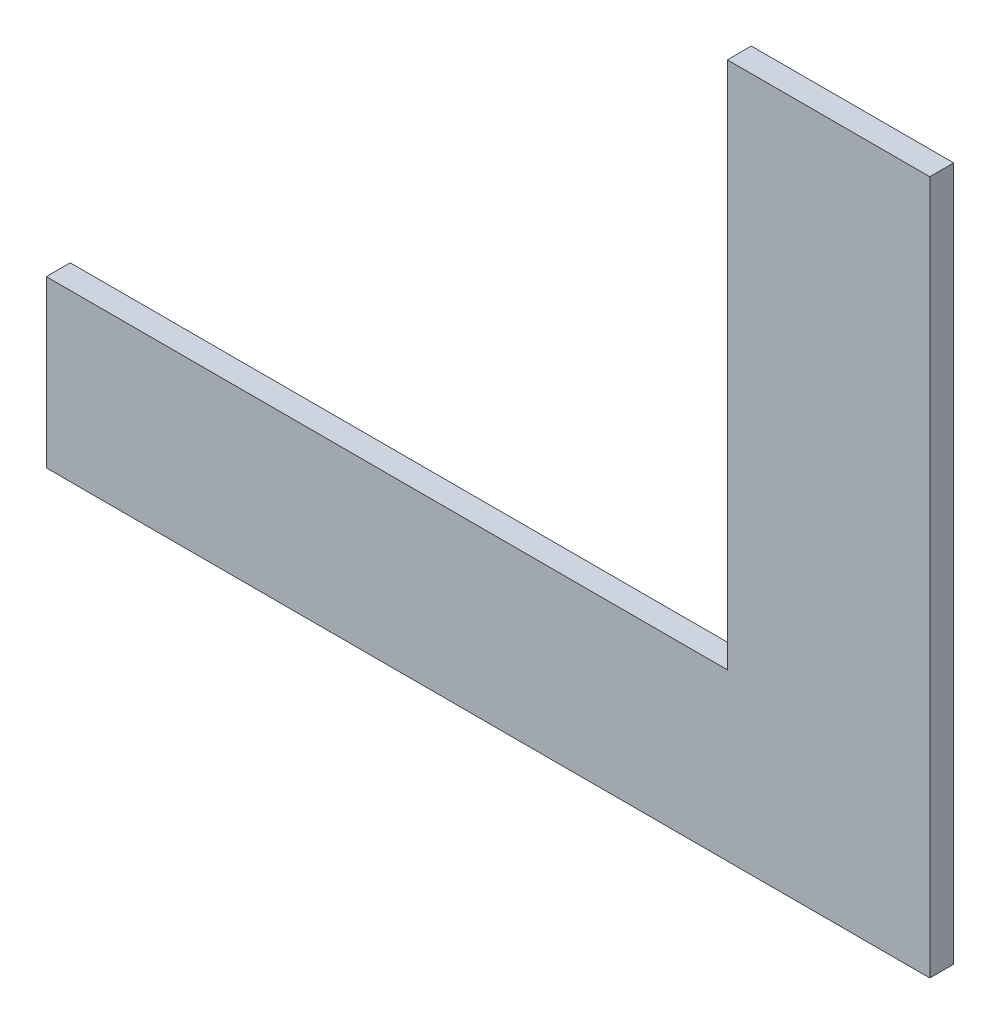
ISO-10303-21;
HEADER;
FILE_DESCRIPTION(('STEP AP214'),'2;1');
FILE_NAME('part.step','',(''),(''),'','','');
FILE_SCHEMA(('AUTOMOTIVE_DESIGN { 1 0 10303 214 1 1 1 1 }'));
ENDSEC;
DATA;
#1=APPLICATION_CONTEXT('core data for automotive mechanical design processes');
#2=APPLICATION_PROTOCOL_DEFINITION('international standard','automotive_design',2000,#1);
#3=PRODUCT_CONTEXT('',#1,'mechanical');
#4=PRODUCT('Part','Part','',(#3));
#5=PRODUCT_RELATED_PRODUCT_CATEGORY('part','',(#4));
#6=PRODUCT_DEFINITION_FORMATION('','',#4);
#7=PRODUCT_DEFINITION_CONTEXT('part definition',#1,'design');
#8=PRODUCT_DEFINITION('design','',#6,#7);
#9=PRODUCT_DEFINITION_SHAPE('','',#8);
#10=(LENGTH_UNIT() NAMED_UNIT(*) SI_UNIT(.MILLI.,.METRE.));
#11=(NAMED_UNIT(*) PLANE_ANGLE_UNIT() SI_UNIT($,.RADIAN.));
#12=(NAMED_UNIT(*) SI_UNIT($,.STERADIAN.) SOLID_ANGLE_UNIT());
#13=UNCERTAINTY_MEASURE_WITH_UNIT(LENGTH_MEASURE(1.E-05),#10,'distance_accuracy_value','');
#14=(GEOMETRIC_REPRESENTATION_CONTEXT(3) GLOBAL_UNCERTAINTY_ASSIGNED_CONTEXT((#13)) GLOBAL_UNIT_ASSIGNED_CONTEXT((#10,
#11,#12)) REPRESENTATION_CONTEXT('',''));
#15=CARTESIAN_POINT('',(0.,0.,0.));
#16=DIRECTION('',(0.,0.,1.));
#17=DIRECTION('',(1.,0.,0.));
#18=AXIS2_PLACEMENT_3D('',#15,#16,#17);
#19=CARTESIAN_POINT('',(-10.3846153846154,-15.,0.5));
#20=DIRECTION('',(0.,1.,0.));
#21=DIRECTION('',(0.,0.,1.));
#22=AXIS2_PLACEMENT_3D('',#19,#20,#21);
#23=PLANE('',#22);
#24=DIRECTION('',(1.,0.,0.));
#25=VECTOR('',#24,1.);
#26=CARTESIAN_POINT('',(-10.3846153846154,-15.,0.));
#27=LINE('',#26,#25);
#28=CARTESIAN_POINT('',(-10.3846153846154,-15.,0.));
#29=VERTEX_POINT('',#28);
#30=CARTESIAN_POINT('',(8.07692307692309,-15.,0.));
#31=VERTEX_POINT('',#30);
#32=EDGE_CURVE('E108',#29,#31,#27,.T.);
#33=ORIENTED_EDGE('',*,*,#32,.T.);
#34=DIRECTION('',(0.,0.,-1.));
#35=VECTOR('',#34,1.);
#36=CARTESIAN_POINT('',(8.07692307692309,-15.,0.5));
#37=LINE('',#36,#35);
#38=CARTESIAN_POINT('',(8.07692307692309,-15.,0.5));
#39=VERTEX_POINT('',#38);
#40=EDGE_CURVE('E50',#39,#31,#37,.T.);
#41=ORIENTED_EDGE('',*,*,#40,.F.);
#42=DIRECTION('',(1.,0.,0.));
#43=VECTOR('',#42,1.);
#44=CARTESIAN_POINT('',(-10.3846153846154,-15.,0.5));
#45=LINE('',#44,#43);
#46=CARTESIAN_POINT('',(-10.3846153846154,-15.,0.5));
#47=VERTEX_POINT('',#46);
#48=EDGE_CURVE('E103',#47,#39,#45,.T.);
#49=ORIENTED_EDGE('',*,*,#48,.F.);
#50=DIRECTION('',(0.,0.,-1.));
#51=VECTOR('',#50,1.);
#52=CARTESIAN_POINT('',(-10.3846153846154,-15.,0.5));
#53=LINE('',#52,#51);
#54=EDGE_CURVE('E99',#47,#29,#53,.T.);
#55=ORIENTED_EDGE('',*,*,#54,.T.);
#56=EDGE_LOOP('',(#33,#41,#49,#55));
#57=FACE_BOUND('',#56,.T.);
#58=ADVANCED_FACE('F39',(#57),#23,.F.);
#59=CARTESIAN_POINT('',(-10.3846153846154,-11.5384615384615,0.5));
#60=DIRECTION('',(1.,0.,0.));
#61=DIRECTION('',(0.,0.,-1.));
#62=AXIS2_PLACEMENT_3D('',#59,#60,#61);
#63=PLANE('',#62);
#64=DIRECTION('',(0.,-1.,0.));
#65=VECTOR('',#64,1.);
#66=CARTESIAN_POINT('',(-10.3846153846154,-11.5384615384615,0.));
#67=LINE('',#66,#65);
#68=CARTESIAN_POINT('',(-10.3846153846154,-11.5384615384615,0.));
#69=VERTEX_POINT('',#68);
#70=EDGE_CURVE('E96',#69,#29,#67,.T.);
#71=ORIENTED_EDGE('',*,*,#70,.T.);
#72=ORIENTED_EDGE('',*,*,#54,.F.);
#73=DIRECTION('',(0.,-1.,0.));
#74=VECTOR('',#73,1.);
#75=CARTESIAN_POINT('',(-10.3846153846154,-11.5384615384615,0.5));
#76=LINE('',#75,#74);
#77=CARTESIAN_POINT('',(-10.3846153846154,-11.5384615384615,0.5));
#78=VERTEX_POINT('',#77);
#79=EDGE_CURVE('E115',#78,#47,#76,.T.);
#80=ORIENTED_EDGE('',*,*,#79,.F.);
#81=DIRECTION('',(0.,0.,-1.));
#82=VECTOR('',#81,1.);
#83=CARTESIAN_POINT('',(-10.3846153846154,-11.5384615384615,0.5));
#84=LINE('',#83,#82);
#85=EDGE_CURVE('E105',#78,#69,#84,.T.);
#86=ORIENTED_EDGE('',*,*,#85,.T.);
#87=EDGE_LOOP('',(#71,#72,#80,#86));
#88=FACE_BOUND('',#87,.T.);
#89=ADVANCED_FACE('F97',(#88),#63,.F.);
#90=CARTESIAN_POINT('',(3.84615384615386,-11.5384615384615,0.5));
#91=DIRECTION('',(0.,-1.,0.));
#92=DIRECTION('',(0.,0.,-1.));
#93=AXIS2_PLACEMENT_3D('',#90,#91,#92);
#94=PLANE('',#93);
#95=DIRECTION('',(-1.,0.,0.));
#96=VECTOR('',#95,1.);
#97=CARTESIAN_POINT('',(3.84615384615386,-11.5384615384615,0.));
#98=LINE('',#97,#96);
#99=CARTESIAN_POINT('',(3.84615384615386,-11.5384615384615,0.));
#100=VERTEX_POINT('',#99);
#101=EDGE_CURVE('E89',#100,#69,#98,.T.);
#102=ORIENTED_EDGE('',*,*,#101,.T.);
#103=ORIENTED_EDGE('',*,*,#85,.F.);
#104=DIRECTION('',(-1.,0.,0.));
#105=VECTOR('',#104,1.);
#106=CARTESIAN_POINT('',(3.84615384615386,-11.5384615384615,0.5));
#107=LINE('',#106,#105);
#108=CARTESIAN_POINT('',(3.84615384615386,-11.5384615384615,0.5));
#109=VERTEX_POINT('',#108);
#110=EDGE_CURVE('E139',#109,#78,#107,.T.);
#111=ORIENTED_EDGE('',*,*,#110,.F.);
#112=DIRECTION('',(0.,0.,-1.));
#113=VECTOR('',#112,1.);
#114=CARTESIAN_POINT('',(3.84615384615386,-11.5384615384615,0.5));
#115=LINE('',#114,#113);
#116=EDGE_CURVE('E126',#109,#100,#115,.T.);
#117=ORIENTED_EDGE('',*,*,#116,.T.);
#118=EDGE_LOOP('',(#102,#103,#111,#117));
#119=FACE_BOUND('',#118,.T.);
#120=ADVANCED_FACE('F143',(#119),#94,.F.);
#121=CARTESIAN_POINT('',(0.,0.,0.5));
#122=DIRECTION('',(0.,0.,1.));
#123=DIRECTION('',(1.,0.,0.));
#124=AXIS2_PLACEMENT_3D('',#121,#122,#123);
#125=PLANE('',#124);
#126=DIRECTION('',(1.,0.,0.));
#127=VECTOR('',#126,1.);
#128=CARTESIAN_POINT('',(0.,-0.5,0.5));
#129=LINE('',#128,#127);
#130=CARTESIAN_POINT('',(3.84615384615386,-0.499999999999997,0.5));
#131=VERTEX_POINT('',#130);
#132=CARTESIAN_POINT('',(8.07692307692309,-0.5,0.5));
#133=VERTEX_POINT('',#132);
#134=EDGE_CURVE('E68',#131,#133,#129,.T.);
#135=ORIENTED_EDGE('',*,*,#134,.F.);
#136=DIRECTION('',(0.,-1.,0.));
#137=VECTOR('',#136,1.);
#138=CARTESIAN_POINT('',(3.84615384615386,15.,0.5));
#139=LINE('',#138,#137);
#140=EDGE_CURVE('E132',#131,#109,#139,.T.);
#141=ORIENTED_EDGE('',*,*,#140,.T.);
#142=ORIENTED_EDGE('',*,*,#110,.T.);
#143=ORIENTED_EDGE('',*,*,#79,.T.);
#144=ORIENTED_EDGE('',*,*,#48,.T.);
#145=DIRECTION('',(0.,1.,0.));
#146=VECTOR('',#145,1.);
#147=CARTESIAN_POINT('',(8.07692307692309,-15.,0.5));
#148=LINE('',#147,#146);
#149=EDGE_CURVE('E135',#39,#133,#148,.T.);
#150=ORIENTED_EDGE('',*,*,#149,.T.);
#151=EDGE_LOOP('',(#135,#141,#142,#143,#144,#150));
#152=FACE_BOUND('',#151,.T.);
#153=ADVANCED_FACE('F136',(#152),#125,.T.);
#154=CARTESIAN_POINT('',(3.84615384615386,15.,0.5));
#155=DIRECTION('',(1.,0.,0.));
#156=DIRECTION('',(0.,0.,-1.));
#157=AXIS2_PLACEMENT_3D('',#154,#155,#156);
#158=PLANE('',#157);
#159=ORIENTED_EDGE('',*,*,#140,.F.);
#160=DIRECTION('',(0.,0.,-1.));
#161=VECTOR('',#160,1.);
#162=CARTESIAN_POINT('',(3.84615384615386,-0.5,0.5));
#163=LINE('',#162,#161);
#164=CARTESIAN_POINT('',(3.84615384615386,-0.499999999999999,0.));
#165=VERTEX_POINT('',#164);
#166=EDGE_CURVE('E53',#131,#165,#163,.T.);
#167=ORIENTED_EDGE('',*,*,#166,.T.);
#168=DIRECTION('',(0.,-1.,0.));
#169=VECTOR('',#168,1.);
#170=CARTESIAN_POINT('',(3.84615384615386,15.,0.));
#171=LINE('',#170,#169);
#172=EDGE_CURVE('E116',#165,#100,#171,.T.);
#173=ORIENTED_EDGE('',*,*,#172,.T.);
#174=ORIENTED_EDGE('',*,*,#116,.F.);
#175=EDGE_LOOP('',(#159,#167,#173,#174));
#176=FACE_BOUND('',#175,.T.);
#177=ADVANCED_FACE('F155',(#176),#158,.F.);
#178=CARTESIAN_POINT('',(8.07692307692309,-15.,0.5));
#179=DIRECTION('',(-1.,0.,0.));
#180=DIRECTION('',(0.,0.,1.));
#181=AXIS2_PLACEMENT_3D('',#178,#179,#180);
#182=PLANE('',#181);
#183=DIRECTION('',(0.,1.,0.));
#184=VECTOR('',#183,1.);
#185=CARTESIAN_POINT('',(8.07692307692309,-15.,0.));
#186=LINE('',#185,#184);
#187=CARTESIAN_POINT('',(8.07692307692309,-0.5,0.));
#188=VERTEX_POINT('',#187);
#189=EDGE_CURVE('E117',#31,#188,#186,.T.);
#190=ORIENTED_EDGE('',*,*,#189,.T.);
#191=DIRECTION('',(0.,0.,1.));
#192=VECTOR('',#191,1.);
#193=CARTESIAN_POINT('',(8.07692307692309,-0.5,0.5));
#194=LINE('',#193,#192);
#195=EDGE_CURVE('E63',#188,#133,#194,.T.);
#196=ORIENTED_EDGE('',*,*,#195,.T.);
#197=ORIENTED_EDGE('',*,*,#149,.F.);
#198=ORIENTED_EDGE('',*,*,#40,.T.);
#199=EDGE_LOOP('',(#190,#196,#197,#198));
#200=FACE_BOUND('',#199,.T.);
#201=ADVANCED_FACE('F127',(#200),#182,.F.);
#202=CARTESIAN_POINT('',(0.,0.,0.));
#203=DIRECTION('',(0.,0.,1.));
#204=DIRECTION('',(1.,0.,0.));
#205=AXIS2_PLACEMENT_3D('',#202,#203,#204);
#206=PLANE('',#205);
#207=DIRECTION('',(-1.,0.,0.));
#208=VECTOR('',#207,1.);
#209=CARTESIAN_POINT('',(-17.,-0.5,0.));
#210=LINE('',#209,#208);
#211=EDGE_CURVE('E11',#188,#165,#210,.T.);
#212=ORIENTED_EDGE('',*,*,#211,.F.);
#213=ORIENTED_EDGE('',*,*,#189,.F.);
#214=ORIENTED_EDGE('',*,*,#32,.F.);
#215=ORIENTED_EDGE('',*,*,#70,.F.);
#216=ORIENTED_EDGE('',*,*,#101,.F.);
#217=ORIENTED_EDGE('',*,*,#172,.F.);
#218=EDGE_LOOP('',(#212,#213,#214,#215,#216,#217));
#219=FACE_BOUND('',#218,.T.);
#220=ADVANCED_FACE('F114',(#219),#206,.F.);
#221=CARTESIAN_POINT('',(-17.,-0.5,1.));
#222=DIRECTION('',(0.,-1.,0.));
#223=DIRECTION('',(0.,0.,-1.));
#224=AXIS2_PLACEMENT_3D('',#221,#222,#223);
#225=PLANE('',#224);
#226=ORIENTED_EDGE('',*,*,#211,.T.);
#227=ORIENTED_EDGE('',*,*,#166,.F.);
#228=ORIENTED_EDGE('',*,*,#134,.T.);
#229=ORIENTED_EDGE('',*,*,#195,.F.);
#230=EDGE_LOOP('',(#226,#227,#228,#229));
#231=FACE_BOUND('',#230,.T.);
#232=ADVANCED_FACE('F258',(#231),#225,.F.);
#233=CLOSED_SHELL('',(#58,#89,#120,#153,#177,#201,#220,#232));
#234=MANIFOLD_SOLID_BREP('B2',#233);
#235=ADVANCED_BREP_SHAPE_REPRESENTATION('',(#18,#234),#14);
#236=SHAPE_DEFINITION_REPRESENTATION(#9,#235);
ENDSEC;
END-ISO-10303-21;
